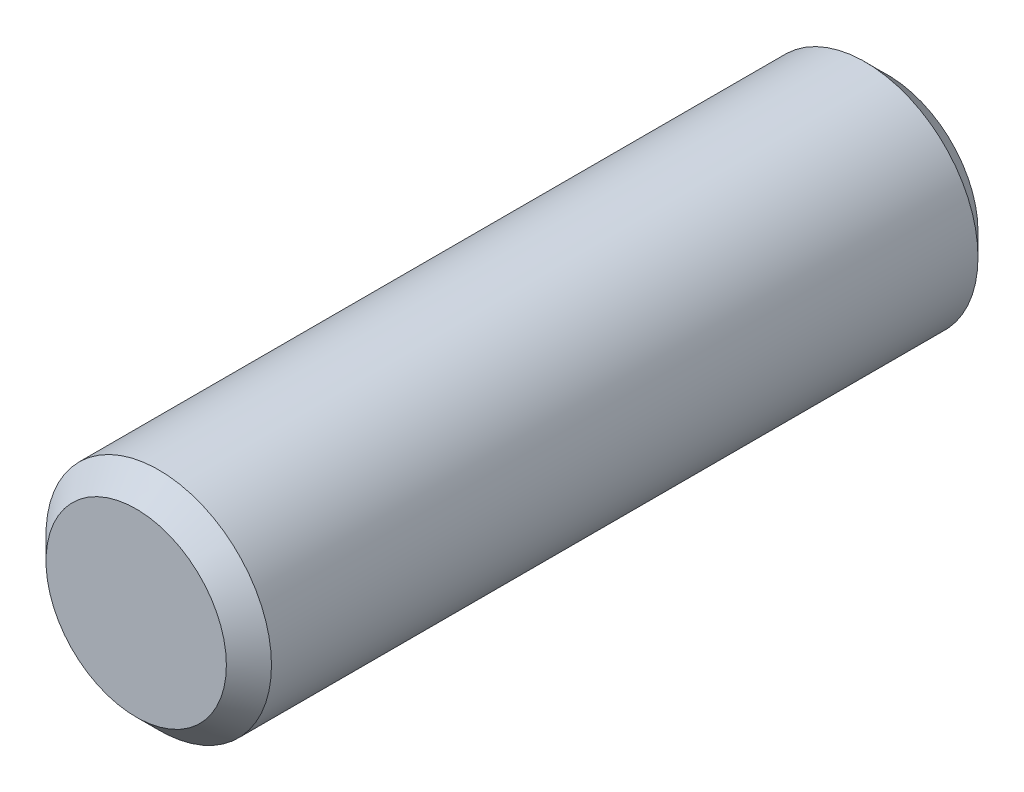
ISO-10303-21;
HEADER;
FILE_DESCRIPTION(('STEP AP214'),'2;1');
FILE_NAME('part.step','',(''),(''),'','','');
FILE_SCHEMA(('AUTOMOTIVE_DESIGN { 1 0 10303 214 1 1 1 1 }'));
ENDSEC;
DATA;
#1=APPLICATION_CONTEXT('core data for automotive mechanical design processes');
#2=APPLICATION_PROTOCOL_DEFINITION('international standard','automotive_design',2000,#1);
#3=PRODUCT_CONTEXT('',#1,'mechanical');
#4=PRODUCT('Part','Part','',(#3));
#5=PRODUCT_RELATED_PRODUCT_CATEGORY('part','',(#4));
#6=PRODUCT_DEFINITION_FORMATION('','',#4);
#7=PRODUCT_DEFINITION_CONTEXT('part definition',#1,'design');
#8=PRODUCT_DEFINITION('design','',#6,#7);
#9=PRODUCT_DEFINITION_SHAPE('','',#8);
#10=(LENGTH_UNIT() NAMED_UNIT(*) SI_UNIT(.MILLI.,.METRE.));
#11=(NAMED_UNIT(*) PLANE_ANGLE_UNIT() SI_UNIT($,.RADIAN.));
#12=(NAMED_UNIT(*) SI_UNIT($,.STERADIAN.) SOLID_ANGLE_UNIT());
#13=UNCERTAINTY_MEASURE_WITH_UNIT(LENGTH_MEASURE(1.E-05),#10,'distance_accuracy_value','');
#14=(GEOMETRIC_REPRESENTATION_CONTEXT(3) GLOBAL_UNCERTAINTY_ASSIGNED_CONTEXT((#13)) GLOBAL_UNIT_ASSIGNED_CONTEXT((#10,
#11,#12)) REPRESENTATION_CONTEXT('',''));
#15=CARTESIAN_POINT('',(0.,0.,0.));
#16=DIRECTION('',(0.,0.,1.));
#17=DIRECTION('',(1.,0.,0.));
#18=AXIS2_PLACEMENT_3D('',#15,#16,#17);
#19=CARTESIAN_POINT('',(0.,0.,10.));
#20=DIRECTION('',(0.,0.,-1.));
#21=DIRECTION('',(-1.,0.,0.));
#22=AXIS2_PLACEMENT_3D('',#19,#20,#21);
#23=CYLINDRICAL_SURFACE('',#22,1.5);
#24=CARTESIAN_POINT('',(0.,0.,0.3));
#25=DIRECTION('',(0.,0.,1.));
#26=DIRECTION('',(1.,0.,0.));
#27=AXIS2_PLACEMENT_3D('',#24,#25,#26);
#28=CIRCLE('',#27,1.5);
#29=CARTESIAN_POINT('',(1.5,0.,0.3));
#30=VERTEX_POINT('',#29);
#31=EDGE_CURVE('E27',#30,#30,#28,.T.);
#32=ORIENTED_EDGE('',*,*,#31,.T.);
#33=EDGE_LOOP('',(#32));
#34=FACE_BOUND('',#33,.T.);
#35=CARTESIAN_POINT('',(0.,0.,9.7));
#36=DIRECTION('',(0.,0.,1.));
#37=DIRECTION('',(1.,0.,0.));
#38=AXIS2_PLACEMENT_3D('',#35,#36,#37);
#39=CIRCLE('',#38,1.5);
#40=CARTESIAN_POINT('',(1.5,0.,9.7));
#41=VERTEX_POINT('',#40);
#42=EDGE_CURVE('E28',#41,#41,#39,.F.);
#43=ORIENTED_EDGE('',*,*,#42,.T.);
#44=EDGE_LOOP('',(#43));
#45=FACE_BOUND('',#44,.T.);
#46=ADVANCED_FACE('F15',(#34,#45),#23,.T.);
#47=CARTESIAN_POINT('',(0.,0.,10.));
#48=DIRECTION('',(0.,0.,1.));
#49=DIRECTION('',(1.,0.,0.));
#50=AXIS2_PLACEMENT_3D('',#47,#48,#49);
#51=PLANE('',#50);
#52=CARTESIAN_POINT('',(0.,0.,10.));
#53=DIRECTION('',(0.,0.,1.));
#54=DIRECTION('',(1.,0.,0.));
#55=AXIS2_PLACEMENT_3D('',#52,#53,#54);
#56=CIRCLE('',#55,1.2);
#57=CARTESIAN_POINT('',(1.2,0.,10.));
#58=VERTEX_POINT('',#57);
#59=EDGE_CURVE('E10',#58,#58,#56,.T.);
#60=ORIENTED_EDGE('',*,*,#59,.T.);
#61=EDGE_LOOP('',(#60));
#62=FACE_BOUND('',#61,.T.);
#63=ADVANCED_FACE('F48',(#62),#51,.T.);
#64=CARTESIAN_POINT('',(0.,0.,0.));
#65=DIRECTION('',(0.,0.,1.));
#66=DIRECTION('',(1.,0.,0.));
#67=AXIS2_PLACEMENT_3D('',#64,#65,#66);
#68=PLANE('',#67);
#69=CARTESIAN_POINT('',(0.,0.,0.));
#70=DIRECTION('',(0.,0.,1.));
#71=DIRECTION('',(1.,0.,0.));
#72=AXIS2_PLACEMENT_3D('',#69,#70,#71);
#73=CIRCLE('',#72,1.2);
#74=CARTESIAN_POINT('',(1.2,0.,0.));
#75=VERTEX_POINT('',#74);
#76=EDGE_CURVE('E22',#75,#75,#73,.F.);
#77=ORIENTED_EDGE('',*,*,#76,.T.);
#78=EDGE_LOOP('',(#77));
#79=FACE_BOUND('',#78,.T.);
#80=ADVANCED_FACE('F44',(#79),#68,.F.);
#81=CARTESIAN_POINT('',(0.,0.,0.3));
#82=DIRECTION('',(0.,0.,1.));
#83=DIRECTION('',(1.,0.,0.));
#84=AXIS2_PLACEMENT_3D('',#81,#82,#83);
#85=CONICAL_SURFACE('',#84,1.5,0.78539816339745);
#86=ORIENTED_EDGE('',*,*,#76,.F.);
#87=EDGE_LOOP('',(#86));
#88=FACE_BOUND('',#87,.T.);
#89=ORIENTED_EDGE('',*,*,#31,.F.);
#90=EDGE_LOOP('',(#89));
#91=FACE_BOUND('',#90,.T.);
#92=ADVANCED_FACE('F39',(#88,#91),#85,.T.);
#93=CARTESIAN_POINT('',(0.,0.,10.));
#94=DIRECTION('',(0.,0.,-1.));
#95=DIRECTION('',(-1.,0.,0.));
#96=AXIS2_PLACEMENT_3D('',#93,#94,#95);
#97=CONICAL_SURFACE('',#96,1.2,0.785398163397446);
#98=ORIENTED_EDGE('',*,*,#42,.F.);
#99=EDGE_LOOP('',(#98));
#100=FACE_BOUND('',#99,.T.);
#101=ORIENTED_EDGE('',*,*,#59,.F.);
#102=EDGE_LOOP('',(#101));
#103=FACE_BOUND('',#102,.T.);
#104=ADVANCED_FACE('F17',(#100,#103),#97,.T.);
#105=CLOSED_SHELL('',(#46,#63,#80,#92,#104));
#106=MANIFOLD_SOLID_BREP('B1',#105);
#107=ADVANCED_BREP_SHAPE_REPRESENTATION('',(#18,#106),#14);
#108=SHAPE_DEFINITION_REPRESENTATION(#9,#107);
ENDSEC;
END-ISO-10303-21;
